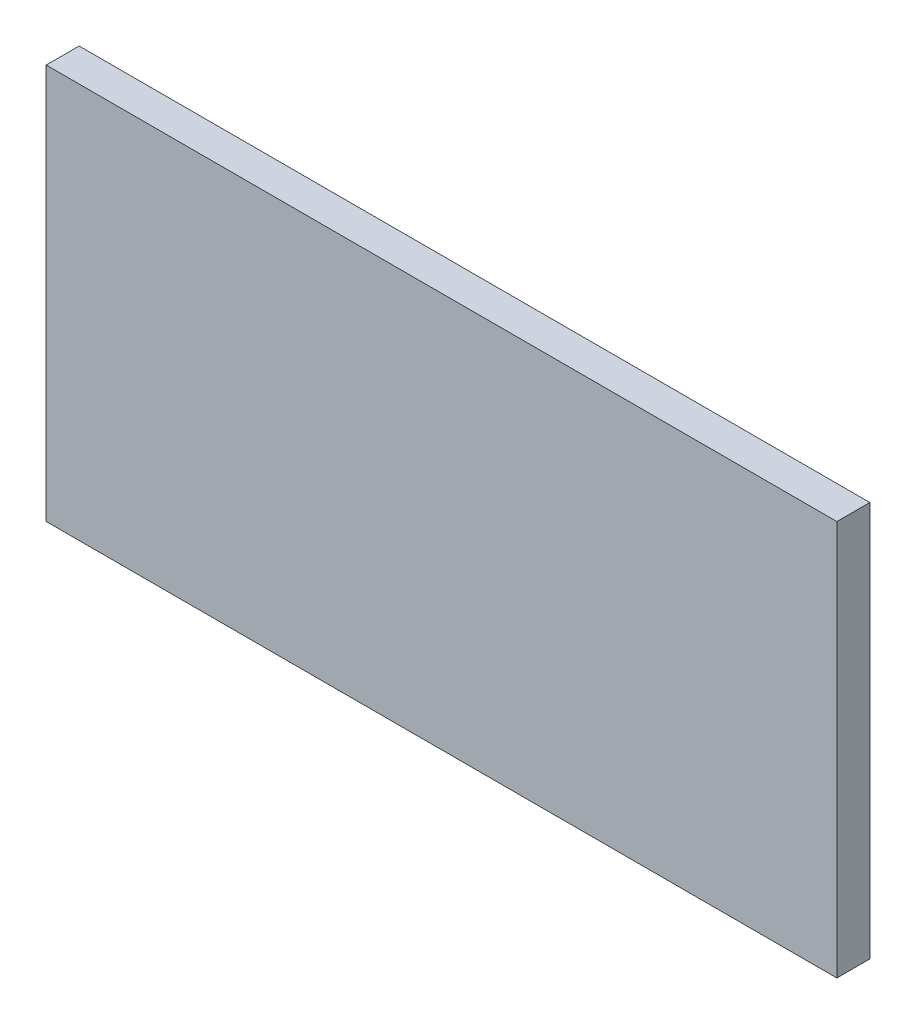
ISO-10303-21;
HEADER;
FILE_DESCRIPTION(('STEP AP214'),'2;1');
FILE_NAME('part.step','',(''),(''),'','','');
FILE_SCHEMA(('AUTOMOTIVE_DESIGN { 1 0 10303 214 1 1 1 1 }'));
ENDSEC;
DATA;
#1=APPLICATION_CONTEXT('core data for automotive mechanical design processes');
#2=APPLICATION_PROTOCOL_DEFINITION('international standard','automotive_design',2000,#1);
#3=PRODUCT_CONTEXT('',#1,'mechanical');
#4=PRODUCT('Part','Part','',(#3));
#5=PRODUCT_RELATED_PRODUCT_CATEGORY('part','',(#4));
#6=PRODUCT_DEFINITION_FORMATION('','',#4);
#7=PRODUCT_DEFINITION_CONTEXT('part definition',#1,'design');
#8=PRODUCT_DEFINITION('design','',#6,#7);
#9=PRODUCT_DEFINITION_SHAPE('','',#8);
#10=(LENGTH_UNIT() NAMED_UNIT(*) SI_UNIT(.MILLI.,.METRE.));
#11=(NAMED_UNIT(*) PLANE_ANGLE_UNIT() SI_UNIT($,.RADIAN.));
#12=(NAMED_UNIT(*) SI_UNIT($,.STERADIAN.) SOLID_ANGLE_UNIT());
#13=UNCERTAINTY_MEASURE_WITH_UNIT(LENGTH_MEASURE(1.E-05),#10,'distance_accuracy_value','');
#14=(GEOMETRIC_REPRESENTATION_CONTEXT(3) GLOBAL_UNCERTAINTY_ASSIGNED_CONTEXT((#13)) GLOBAL_UNIT_ASSIGNED_CONTEXT((#10,
#11,#12)) REPRESENTATION_CONTEXT('',''));
#15=CARTESIAN_POINT('',(0.,0.,0.));
#16=DIRECTION('',(0.,0.,1.));
#17=DIRECTION('',(1.,0.,0.));
#18=AXIS2_PLACEMENT_3D('',#15,#16,#17);
#19=CARTESIAN_POINT('',(600.,-300.,-25.));
#20=DIRECTION('',(1.,0.,0.));
#21=DIRECTION('',(0.,0.,-1.));
#22=AXIS2_PLACEMENT_3D('',#19,#20,#21);
#23=PLANE('',#22);
#24=DIRECTION('',(0.,0.,1.));
#25=VECTOR('',#24,1.);
#26=CARTESIAN_POINT('',(600.,300.,-25.));
#27=LINE('',#26,#25);
#28=CARTESIAN_POINT('',(600.,300.,-25.));
#29=VERTEX_POINT('',#28);
#30=CARTESIAN_POINT('',(600.,300.,25.));
#31=VERTEX_POINT('',#30);
#32=EDGE_CURVE('E45',#29,#31,#27,.T.);
#33=ORIENTED_EDGE('',*,*,#32,.T.);
#34=DIRECTION('',(0.,1.,0.));
#35=VECTOR('',#34,1.);
#36=CARTESIAN_POINT('',(600.,-300.,25.));
#37=LINE('',#36,#35);
#38=CARTESIAN_POINT('',(600.,-300.,25.));
#39=VERTEX_POINT('',#38);
#40=EDGE_CURVE('E78',#39,#31,#37,.T.);
#41=ORIENTED_EDGE('',*,*,#40,.F.);
#42=DIRECTION('',(0.,0.,1.));
#43=VECTOR('',#42,1.);
#44=CARTESIAN_POINT('',(600.,-300.,-25.));
#45=LINE('',#44,#43);
#46=CARTESIAN_POINT('',(600.,-300.,-25.));
#47=VERTEX_POINT('',#46);
#48=EDGE_CURVE('E11',#47,#39,#45,.T.);
#49=ORIENTED_EDGE('',*,*,#48,.F.);
#50=DIRECTION('',(0.,1.,0.));
#51=VECTOR('',#50,1.);
#52=CARTESIAN_POINT('',(600.,-300.,-25.));
#53=LINE('',#52,#51);
#54=EDGE_CURVE('E79',#47,#29,#53,.T.);
#55=ORIENTED_EDGE('',*,*,#54,.T.);
#56=EDGE_LOOP('',(#33,#41,#49,#55));
#57=FACE_BOUND('',#56,.T.);
#58=ADVANCED_FACE('F39',(#57),#23,.T.);
#59=CARTESIAN_POINT('',(-600.,-300.,-25.));
#60=DIRECTION('',(0.,-1.,0.));
#61=DIRECTION('',(0.,0.,-1.));
#62=AXIS2_PLACEMENT_3D('',#59,#60,#61);
#63=PLANE('',#62);
#64=ORIENTED_EDGE('',*,*,#48,.T.);
#65=DIRECTION('',(1.,0.,0.));
#66=VECTOR('',#65,1.);
#67=CARTESIAN_POINT('',(-600.,-300.,25.));
#68=LINE('',#67,#66);
#69=CARTESIAN_POINT('',(-600.,-300.,25.));
#70=VERTEX_POINT('',#69);
#71=EDGE_CURVE('E96',#70,#39,#68,.T.);
#72=ORIENTED_EDGE('',*,*,#71,.F.);
#73=DIRECTION('',(0.,0.,1.));
#74=VECTOR('',#73,1.);
#75=CARTESIAN_POINT('',(-600.,-300.,-25.));
#76=LINE('',#75,#74);
#77=CARTESIAN_POINT('',(-600.,-300.,-25.));
#78=VERTEX_POINT('',#77);
#79=EDGE_CURVE('E50',#78,#70,#76,.T.);
#80=ORIENTED_EDGE('',*,*,#79,.F.);
#81=DIRECTION('',(1.,0.,0.));
#82=VECTOR('',#81,1.);
#83=CARTESIAN_POINT('',(-600.,-300.,-25.));
#84=LINE('',#83,#82);
#85=EDGE_CURVE('E83',#78,#47,#84,.T.);
#86=ORIENTED_EDGE('',*,*,#85,.T.);
#87=EDGE_LOOP('',(#64,#72,#80,#86));
#88=FACE_BOUND('',#87,.T.);
#89=ADVANCED_FACE('F112',(#88),#63,.T.);
#90=CARTESIAN_POINT('',(-600.,-300.,-25.));
#91=DIRECTION('',(-1.,0.,0.));
#92=DIRECTION('',(0.,0.,1.));
#93=AXIS2_PLACEMENT_3D('',#90,#91,#92);
#94=PLANE('',#93);
#95=ORIENTED_EDGE('',*,*,#79,.T.);
#96=DIRECTION('',(0.,-1.,0.));
#97=VECTOR('',#96,1.);
#98=CARTESIAN_POINT('',(-600.,-300.,25.));
#99=LINE('',#98,#97);
#100=CARTESIAN_POINT('',(-600.,300.,25.));
#101=VERTEX_POINT('',#100);
#102=EDGE_CURVE('E95',#101,#70,#99,.T.);
#103=ORIENTED_EDGE('',*,*,#102,.F.);
#104=DIRECTION('',(0.,0.,1.));
#105=VECTOR('',#104,1.);
#106=CARTESIAN_POINT('',(-600.,300.,-25.));
#107=LINE('',#106,#105);
#108=CARTESIAN_POINT('',(-600.,300.,-25.));
#109=VERTEX_POINT('',#108);
#110=EDGE_CURVE('E81',#109,#101,#107,.T.);
#111=ORIENTED_EDGE('',*,*,#110,.F.);
#112=DIRECTION('',(0.,-1.,0.));
#113=VECTOR('',#112,1.);
#114=CARTESIAN_POINT('',(-600.,-300.,-25.));
#115=LINE('',#114,#113);
#116=EDGE_CURVE('E102',#109,#78,#115,.T.);
#117=ORIENTED_EDGE('',*,*,#116,.T.);
#118=EDGE_LOOP('',(#95,#103,#111,#117));
#119=FACE_BOUND('',#118,.T.);
#120=ADVANCED_FACE('F107',(#119),#94,.T.);
#121=CARTESIAN_POINT('',(-600.,300.,-25.));
#122=DIRECTION('',(0.,1.,0.));
#123=DIRECTION('',(0.,0.,1.));
#124=AXIS2_PLACEMENT_3D('',#121,#122,#123);
#125=PLANE('',#124);
#126=ORIENTED_EDGE('',*,*,#110,.T.);
#127=DIRECTION('',(-1.,0.,0.));
#128=VECTOR('',#127,1.);
#129=CARTESIAN_POINT('',(-600.,300.,25.));
#130=LINE('',#129,#128);
#131=EDGE_CURVE('E87',#31,#101,#130,.T.);
#132=ORIENTED_EDGE('',*,*,#131,.F.);
#133=ORIENTED_EDGE('',*,*,#32,.F.);
#134=DIRECTION('',(-1.,0.,0.));
#135=VECTOR('',#134,1.);
#136=CARTESIAN_POINT('',(-600.,300.,-25.));
#137=LINE('',#136,#135);
#138=EDGE_CURVE('E105',#29,#109,#137,.T.);
#139=ORIENTED_EDGE('',*,*,#138,.T.);
#140=EDGE_LOOP('',(#126,#132,#133,#139));
#141=FACE_BOUND('',#140,.T.);
#142=ADVANCED_FACE('F86',(#141),#125,.T.);
#143=CARTESIAN_POINT('',(0.,0.,-25.));
#144=DIRECTION('',(0.,0.,-1.));
#145=DIRECTION('',(-1.,0.,0.));
#146=AXIS2_PLACEMENT_3D('',#143,#144,#145);
#147=PLANE('',#146);
#148=ORIENTED_EDGE('',*,*,#54,.F.);
#149=ORIENTED_EDGE('',*,*,#85,.F.);
#150=ORIENTED_EDGE('',*,*,#116,.F.);
#151=ORIENTED_EDGE('',*,*,#138,.F.);
#152=EDGE_LOOP('',(#148,#149,#150,#151));
#153=FACE_BOUND('',#152,.T.);
#154=ADVANCED_FACE('F114',(#153),#147,.T.);
#155=CARTESIAN_POINT('',(0.,0.,25.));
#156=DIRECTION('',(0.,0.,-1.));
#157=DIRECTION('',(-1.,0.,0.));
#158=AXIS2_PLACEMENT_3D('',#155,#156,#157);
#159=PLANE('',#158);
#160=ORIENTED_EDGE('',*,*,#40,.T.);
#161=ORIENTED_EDGE('',*,*,#131,.T.);
#162=ORIENTED_EDGE('',*,*,#102,.T.);
#163=ORIENTED_EDGE('',*,*,#71,.T.);
#164=EDGE_LOOP('',(#160,#161,#162,#163));
#165=FACE_BOUND('',#164,.T.);
#166=ADVANCED_FACE('F92',(#165),#159,.F.);
#167=CLOSED_SHELL('',(#58,#89,#120,#142,#154,#166));
#168=MANIFOLD_SOLID_BREP('B2',#167);
#169=ADVANCED_BREP_SHAPE_REPRESENTATION('',(#18,#168),#14);
#170=SHAPE_DEFINITION_REPRESENTATION(#9,#169);
ENDSEC;
END-ISO-10303-21;
